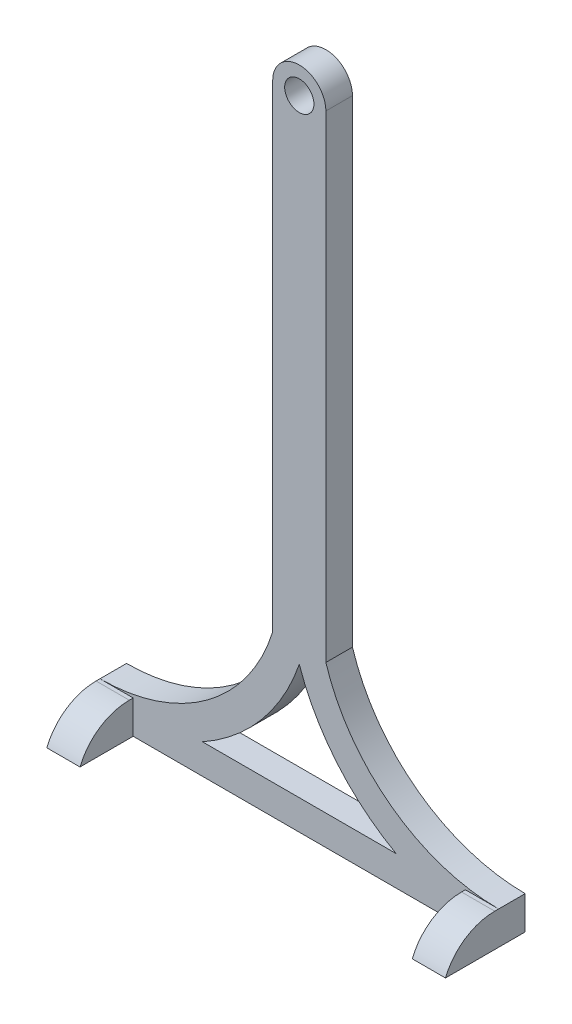
ISO-10303-21;
HEADER;
FILE_DESCRIPTION(('STEP AP214'),'2;1');
FILE_NAME('part.step','',(''),(''),'','','');
FILE_SCHEMA(('AUTOMOTIVE_DESIGN { 1 0 10303 214 1 1 1 1 }'));
ENDSEC;
DATA;
#1=APPLICATION_CONTEXT('core data for automotive mechanical design processes');
#2=APPLICATION_PROTOCOL_DEFINITION('international standard','automotive_design',2000,#1);
#3=PRODUCT_CONTEXT('',#1,'mechanical');
#4=PRODUCT('Part','Part','',(#3));
#5=PRODUCT_RELATED_PRODUCT_CATEGORY('part','',(#4));
#6=PRODUCT_DEFINITION_FORMATION('','',#4);
#7=PRODUCT_DEFINITION_CONTEXT('part definition',#1,'design');
#8=PRODUCT_DEFINITION('design','',#6,#7);
#9=PRODUCT_DEFINITION_SHAPE('','',#8);
#10=(LENGTH_UNIT() NAMED_UNIT(*) SI_UNIT(.MILLI.,.METRE.));
#11=(NAMED_UNIT(*) PLANE_ANGLE_UNIT() SI_UNIT($,.RADIAN.));
#12=(NAMED_UNIT(*) SI_UNIT($,.STERADIAN.) SOLID_ANGLE_UNIT());
#13=UNCERTAINTY_MEASURE_WITH_UNIT(LENGTH_MEASURE(1.E-05),#10,'distance_accuracy_value','');
#14=(GEOMETRIC_REPRESENTATION_CONTEXT(3) GLOBAL_UNCERTAINTY_ASSIGNED_CONTEXT((#13)) GLOBAL_UNIT_ASSIGNED_CONTEXT((#10,
#11,#12)) REPRESENTATION_CONTEXT('',''));
#15=CARTESIAN_POINT('',(0.,0.,0.));
#16=DIRECTION('',(0.,0.,1.));
#17=DIRECTION('',(1.,0.,0.));
#18=AXIS2_PLACEMENT_3D('',#15,#16,#17);
#19=CARTESIAN_POINT('',(30.,32.2359051377666,4.));
#20=DIRECTION('',(0.,0.,-1.));
#21=DIRECTION('',(-1.,0.,0.));
#22=AXIS2_PLACEMENT_3D('',#19,#20,#21);
#23=PLANE('',#22);
#24=CARTESIAN_POINT('',(0.,96.,4.));
#25=DIRECTION('',(0.,0.,1.));
#26=DIRECTION('',(1.,0.,0.));
#27=AXIS2_PLACEMENT_3D('',#24,#25,#26);
#28=CIRCLE('',#27,2.2);
#29=CARTESIAN_POINT('',(2.19999999999998,96.,4.));
#30=VERTEX_POINT('',#29);
#31=EDGE_CURVE('E248',#30,#30,#28,.T.);
#32=ORIENTED_EDGE('',*,*,#31,.F.);
#33=EDGE_LOOP('',(#32));
#34=FACE_BOUND('',#33,.T.);
#35=CARTESIAN_POINT('',(30.,32.2359051377666,4.));
#36=DIRECTION('',(0.,0.,-1.));
#37=DIRECTION('',(-1.,0.,0.));
#38=AXIS2_PLACEMENT_3D('',#35,#36,#37);
#39=CIRCLE('',#38,31.7359051377666);
#40=CARTESIAN_POINT('',(14.5764063492929,4.5,4.));
#41=VERTEX_POINT('',#40);
#42=CARTESIAN_POINT('',(0.,21.8837230048382,4.));
#43=VERTEX_POINT('',#42);
#44=EDGE_CURVE('E215',#41,#43,#39,.T.);
#45=ORIENTED_EDGE('',*,*,#44,.F.);
#46=DIRECTION('',(1.,0.,0.));
#47=VECTOR('',#46,1.);
#48=CARTESIAN_POINT('',(-14.5764063492929,4.5,4.));
#49=LINE('',#48,#47);
#50=CARTESIAN_POINT('',(-14.5764063492929,4.5,4.));
#51=VERTEX_POINT('',#50);
#52=EDGE_CURVE('E223',#51,#41,#49,.T.);
#53=ORIENTED_EDGE('',*,*,#52,.F.);
#54=CARTESIAN_POINT('',(-30.,32.2359051377666,4.));
#55=DIRECTION('',(0.,0.,-1.));
#56=DIRECTION('',(1.,0.,0.));
#57=AXIS2_PLACEMENT_3D('',#54,#55,#56);
#58=CIRCLE('',#57,31.7359051377666);
#59=EDGE_CURVE('E218',#43,#51,#58,.T.);
#60=ORIENTED_EDGE('',*,*,#59,.F.);
#61=EDGE_LOOP('',(#45,#53,#60));
#62=FACE_BOUND('',#61,.T.);
#63=DIRECTION('',(-1.,0.,0.));
#64=VECTOR('',#63,1.);
#65=CARTESIAN_POINT('',(30.,5.,4.));
#66=LINE('',#65,#64);
#67=CARTESIAN_POINT('',(30.,5.,4.));
#68=VERTEX_POINT('',#67);
#69=CARTESIAN_POINT('',(25.,5.,4.));
#70=VERTEX_POINT('',#69);
#71=EDGE_CURVE('E181',#68,#70,#66,.T.);
#72=ORIENTED_EDGE('',*,*,#71,.F.);
#73=CARTESIAN_POINT('',(30.,32.2359051377666,4.));
#74=DIRECTION('',(0.,0.,-1.));
#75=DIRECTION('',(-1.,0.,0.));
#76=AXIS2_PLACEMENT_3D('',#73,#74,#75);
#77=CIRCLE('',#76,27.2359051377666);
#78=CARTESIAN_POINT('',(3.99999999999999,24.1245224767512,4.));
#79=VERTEX_POINT('',#78);
#80=EDGE_CURVE('E256',#68,#79,#77,.T.);
#81=ORIENTED_EDGE('',*,*,#80,.T.);
#82=DIRECTION('',(0.,1.,0.));
#83=VECTOR('',#82,1.);
#84=CARTESIAN_POINT('',(3.99999999999999,96.,4.));
#85=LINE('',#84,#83);
#86=CARTESIAN_POINT('',(3.99999999999999,96.,4.));
#87=VERTEX_POINT('',#86);
#88=EDGE_CURVE('E260',#79,#87,#85,.T.);
#89=ORIENTED_EDGE('',*,*,#88,.T.);
#90=CARTESIAN_POINT('',(0.,96.,4.));
#91=DIRECTION('',(0.,0.,1.));
#92=DIRECTION('',(1.,0.,0.));
#93=AXIS2_PLACEMENT_3D('',#90,#91,#92);
#94=CIRCLE('',#93,4.);
#95=CARTESIAN_POINT('',(-4.00000000000002,96.,4.));
#96=VERTEX_POINT('',#95);
#97=EDGE_CURVE('E264',#87,#96,#94,.T.);
#98=ORIENTED_EDGE('',*,*,#97,.T.);
#99=DIRECTION('',(0.,-1.,0.));
#100=VECTOR('',#99,1.);
#101=CARTESIAN_POINT('',(-4.00000000000002,96.,4.));
#102=LINE('',#101,#100);
#103=CARTESIAN_POINT('',(-3.99999999999998,24.1245224767512,4.));
#104=VERTEX_POINT('',#103);
#105=EDGE_CURVE('E267',#96,#104,#102,.T.);
#106=ORIENTED_EDGE('',*,*,#105,.T.);
#107=CARTESIAN_POINT('',(-30.,32.2359051377666,4.));
#108=DIRECTION('',(0.,0.,-1.));
#109=DIRECTION('',(1.,0.,0.));
#110=AXIS2_PLACEMENT_3D('',#107,#108,#109);
#111=CIRCLE('',#110,27.2359051377666);
#112=CARTESIAN_POINT('',(-30.,5.,4.));
#113=VERTEX_POINT('',#112);
#114=EDGE_CURVE('E270',#104,#113,#111,.T.);
#115=ORIENTED_EDGE('',*,*,#114,.T.);
#116=DIRECTION('',(-1.,0.,0.));
#117=VECTOR('',#116,1.);
#118=CARTESIAN_POINT('',(-30.,5.,4.));
#119=LINE('',#118,#117);
#120=CARTESIAN_POINT('',(-25.,5.,4.));
#121=VERTEX_POINT('',#120);
#122=EDGE_CURVE('E198',#121,#113,#119,.T.);
#123=ORIENTED_EDGE('',*,*,#122,.F.);
#124=DIRECTION('',(0.,1.,0.));
#125=VECTOR('',#124,1.);
#126=CARTESIAN_POINT('',(-25.,0.,4.));
#127=LINE('',#126,#125);
#128=CARTESIAN_POINT('',(-25.,0.,4.));
#129=VERTEX_POINT('',#128);
#130=EDGE_CURVE('E192',#129,#121,#127,.T.);
#131=ORIENTED_EDGE('',*,*,#130,.F.);
#132=DIRECTION('',(1.,0.,0.));
#133=VECTOR('',#132,1.);
#134=CARTESIAN_POINT('',(-30.,0.,4.));
#135=LINE('',#134,#133);
#136=CARTESIAN_POINT('',(25.,0.,4.));
#137=VERTEX_POINT('',#136);
#138=EDGE_CURVE('E274',#129,#137,#135,.T.);
#139=ORIENTED_EDGE('',*,*,#138,.T.);
#140=DIRECTION('',(0.,-1.,0.));
#141=VECTOR('',#140,1.);
#142=CARTESIAN_POINT('',(25.,0.,4.));
#143=LINE('',#142,#141);
#144=EDGE_CURVE('E168',#70,#137,#143,.T.);
#145=ORIENTED_EDGE('',*,*,#144,.F.);
#146=EDGE_LOOP('',(#72,#81,#89,#98,#106,#115,#123,#131,#139,#145));
#147=FACE_BOUND('',#146,.T.);
#148=ADVANCED_FACE('F39',(#34,#62,#147),#23,.F.);
#149=CARTESIAN_POINT('',(30.,32.2359051377666,0.));
#150=DIRECTION('',(0.,0.,-1.));
#151=DIRECTION('',(-1.,0.,0.));
#152=AXIS2_PLACEMENT_3D('',#149,#150,#151);
#153=PLANE('',#152);
#154=CARTESIAN_POINT('',(30.,32.2359051377666,0.));
#155=DIRECTION('',(0.,0.,-1.));
#156=DIRECTION('',(-1.,0.,0.));
#157=AXIS2_PLACEMENT_3D('',#154,#155,#156);
#158=CIRCLE('',#157,27.2359051377666);
#159=CARTESIAN_POINT('',(30.,5.,0.));
#160=VERTEX_POINT('',#159);
#161=CARTESIAN_POINT('',(3.99999999999999,24.1245224767512,0.));
#162=VERTEX_POINT('',#161);
#163=EDGE_CURVE('E252',#160,#162,#158,.T.);
#164=ORIENTED_EDGE('',*,*,#163,.F.);
#165=DIRECTION('',(0.,1.,0.));
#166=VECTOR('',#165,1.);
#167=CARTESIAN_POINT('',(30.,0.,0.));
#168=LINE('',#167,#166);
#169=CARTESIAN_POINT('',(30.,0.,0.));
#170=VERTEX_POINT('',#169);
#171=EDGE_CURVE('E261',#170,#160,#168,.T.);
#172=ORIENTED_EDGE('',*,*,#171,.F.);
#173=DIRECTION('',(1.,0.,0.));
#174=VECTOR('',#173,1.);
#175=CARTESIAN_POINT('',(-30.,0.,0.));
#176=LINE('',#175,#174);
#177=CARTESIAN_POINT('',(-30.,0.,0.));
#178=VERTEX_POINT('',#177);
#179=EDGE_CURVE('E296',#178,#170,#176,.T.);
#180=ORIENTED_EDGE('',*,*,#179,.F.);
#181=DIRECTION('',(0.,-1.,0.));
#182=VECTOR('',#181,1.);
#183=CARTESIAN_POINT('',(-30.,0.,0.));
#184=LINE('',#183,#182);
#185=CARTESIAN_POINT('',(-30.,5.,0.));
#186=VERTEX_POINT('',#185);
#187=EDGE_CURVE('E293',#186,#178,#184,.T.);
#188=ORIENTED_EDGE('',*,*,#187,.F.);
#189=CARTESIAN_POINT('',(-30.,32.2359051377666,0.));
#190=DIRECTION('',(0.,0.,-1.));
#191=DIRECTION('',(1.,0.,0.));
#192=AXIS2_PLACEMENT_3D('',#189,#190,#191);
#193=CIRCLE('',#192,27.2359051377666);
#194=CARTESIAN_POINT('',(-3.99999999999998,24.1245224767512,0.));
#195=VERTEX_POINT('',#194);
#196=EDGE_CURVE('E290',#195,#186,#193,.T.);
#197=ORIENTED_EDGE('',*,*,#196,.F.);
#198=DIRECTION('',(0.,-1.,0.));
#199=VECTOR('',#198,1.);
#200=CARTESIAN_POINT('',(-4.00000000000002,96.,0.));
#201=LINE('',#200,#199);
#202=CARTESIAN_POINT('',(-4.00000000000002,96.,0.));
#203=VERTEX_POINT('',#202);
#204=EDGE_CURVE('E287',#203,#195,#201,.T.);
#205=ORIENTED_EDGE('',*,*,#204,.F.);
#206=CARTESIAN_POINT('',(0.,96.,0.));
#207=DIRECTION('',(0.,0.,1.));
#208=DIRECTION('',(1.,0.,0.));
#209=AXIS2_PLACEMENT_3D('',#206,#207,#208);
#210=CIRCLE('',#209,4.);
#211=CARTESIAN_POINT('',(3.99999999999999,96.,0.));
#212=VERTEX_POINT('',#211);
#213=EDGE_CURVE('E284',#212,#203,#210,.T.);
#214=ORIENTED_EDGE('',*,*,#213,.F.);
#215=DIRECTION('',(0.,1.,0.));
#216=VECTOR('',#215,1.);
#217=CARTESIAN_POINT('',(3.99999999999999,96.,0.));
#218=LINE('',#217,#216);
#219=EDGE_CURVE('E281',#162,#212,#218,.T.);
#220=ORIENTED_EDGE('',*,*,#219,.F.);
#221=EDGE_LOOP('',(#164,#172,#180,#188,#197,#205,#214,#220));
#222=FACE_BOUND('',#221,.T.);
#223=CARTESIAN_POINT('',(0.,96.,0.));
#224=DIRECTION('',(0.,0.,1.));
#225=DIRECTION('',(1.,0.,0.));
#226=AXIS2_PLACEMENT_3D('',#223,#224,#225);
#227=CIRCLE('',#226,2.2);
#228=CARTESIAN_POINT('',(2.19999999999998,96.,0.));
#229=VERTEX_POINT('',#228);
#230=EDGE_CURVE('E247',#229,#229,#227,.T.);
#231=ORIENTED_EDGE('',*,*,#230,.T.);
#232=EDGE_LOOP('',(#231));
#233=FACE_BOUND('',#232,.T.);
#234=DIRECTION('',(1.,0.,0.));
#235=VECTOR('',#234,1.);
#236=CARTESIAN_POINT('',(-14.5764063492929,4.5,0.));
#237=LINE('',#236,#235);
#238=CARTESIAN_POINT('',(-14.5764063492929,4.5,0.));
#239=VERTEX_POINT('',#238);
#240=CARTESIAN_POINT('',(14.5764063492929,4.5,0.));
#241=VERTEX_POINT('',#240);
#242=EDGE_CURVE('E219',#239,#241,#237,.T.);
#243=ORIENTED_EDGE('',*,*,#242,.T.);
#244=CARTESIAN_POINT('',(30.,32.2359051377666,0.));
#245=DIRECTION('',(0.,0.,-1.));
#246=DIRECTION('',(-1.,0.,0.));
#247=AXIS2_PLACEMENT_3D('',#244,#245,#246);
#248=CIRCLE('',#247,31.7359051377666);
#249=CARTESIAN_POINT('',(0.,21.8837230048382,0.));
#250=VERTEX_POINT('',#249);
#251=EDGE_CURVE('E214',#241,#250,#248,.T.);
#252=ORIENTED_EDGE('',*,*,#251,.T.);
#253=CARTESIAN_POINT('',(-30.,32.2359051377666,0.));
#254=DIRECTION('',(0.,0.,-1.));
#255=DIRECTION('',(1.,0.,0.));
#256=AXIS2_PLACEMENT_3D('',#253,#254,#255);
#257=CIRCLE('',#256,31.7359051377666);
#258=EDGE_CURVE('E230',#250,#239,#257,.T.);
#259=ORIENTED_EDGE('',*,*,#258,.T.);
#260=EDGE_LOOP('',(#243,#252,#259));
#261=FACE_BOUND('',#260,.T.);
#262=ADVANCED_FACE('F361',(#222,#233,#261),#153,.T.);
#263=CARTESIAN_POINT('',(30.,32.2359051377666,4.));
#264=DIRECTION('',(0.,0.,-1.));
#265=DIRECTION('',(-1.,0.,0.));
#266=AXIS2_PLACEMENT_3D('',#263,#264,#265);
#267=CYLINDRICAL_SURFACE('',#266,27.2359051377666);
#268=ORIENTED_EDGE('',*,*,#163,.T.);
#269=DIRECTION('',(0.,0.,-1.));
#270=VECTOR('',#269,1.);
#271=CARTESIAN_POINT('',(3.99999999999999,24.1245224767512,4.));
#272=LINE('',#271,#270);
#273=EDGE_CURVE('E161',#79,#162,#272,.T.);
#274=ORIENTED_EDGE('',*,*,#273,.F.);
#275=ORIENTED_EDGE('',*,*,#80,.F.);
#276=DIRECTION('',(0.,0.,-1.));
#277=VECTOR('',#276,1.);
#278=CARTESIAN_POINT('',(30.,5.,4.));
#279=LINE('',#278,#277);
#280=EDGE_CURVE('E277',#68,#160,#279,.T.);
#281=ORIENTED_EDGE('',*,*,#280,.T.);
#282=EDGE_LOOP('',(#268,#274,#275,#281));
#283=FACE_BOUND('',#282,.T.);
#284=ADVANCED_FACE('F347',(#283),#267,.F.);
#285=CARTESIAN_POINT('',(3.99999999999999,96.,4.));
#286=DIRECTION('',(-1.,0.,0.));
#287=DIRECTION('',(0.,-1.,0.));
#288=AXIS2_PLACEMENT_3D('',#285,#286,#287);
#289=PLANE('',#288);
#290=ORIENTED_EDGE('',*,*,#219,.T.);
#291=DIRECTION('',(0.,0.,-1.));
#292=VECTOR('',#291,1.);
#293=CARTESIAN_POINT('',(3.99999999999999,96.,4.));
#294=LINE('',#293,#292);
#295=EDGE_CURVE('E322',#87,#212,#294,.T.);
#296=ORIENTED_EDGE('',*,*,#295,.F.);
#297=ORIENTED_EDGE('',*,*,#88,.F.);
#298=ORIENTED_EDGE('',*,*,#273,.T.);
#299=EDGE_LOOP('',(#290,#296,#297,#298));
#300=FACE_BOUND('',#299,.T.);
#301=ADVANCED_FACE('F367',(#300),#289,.F.);
#302=CARTESIAN_POINT('',(0.,96.,4.));
#303=DIRECTION('',(0.,0.,-1.));
#304=DIRECTION('',(-1.,0.,0.));
#305=AXIS2_PLACEMENT_3D('',#302,#303,#304);
#306=CYLINDRICAL_SURFACE('',#305,4.);
#307=ORIENTED_EDGE('',*,*,#213,.T.);
#308=DIRECTION('',(0.,0.,-1.));
#309=VECTOR('',#308,1.);
#310=CARTESIAN_POINT('',(-4.00000000000002,96.,4.));
#311=LINE('',#310,#309);
#312=EDGE_CURVE('E318',#96,#203,#311,.T.);
#313=ORIENTED_EDGE('',*,*,#312,.F.);
#314=ORIENTED_EDGE('',*,*,#97,.F.);
#315=ORIENTED_EDGE('',*,*,#295,.T.);
#316=EDGE_LOOP('',(#307,#313,#314,#315));
#317=FACE_BOUND('',#316,.T.);
#318=ADVANCED_FACE('F371',(#317),#306,.T.);
#319=CARTESIAN_POINT('',(-4.00000000000002,96.,4.));
#320=DIRECTION('',(1.,0.,0.));
#321=DIRECTION('',(0.,1.,0.));
#322=AXIS2_PLACEMENT_3D('',#319,#320,#321);
#323=PLANE('',#322);
#324=ORIENTED_EDGE('',*,*,#204,.T.);
#325=DIRECTION('',(0.,0.,-1.));
#326=VECTOR('',#325,1.);
#327=CARTESIAN_POINT('',(-3.99999999999998,24.1245224767512,4.));
#328=LINE('',#327,#326);
#329=EDGE_CURVE('E314',#104,#195,#328,.T.);
#330=ORIENTED_EDGE('',*,*,#329,.F.);
#331=ORIENTED_EDGE('',*,*,#105,.F.);
#332=ORIENTED_EDGE('',*,*,#312,.T.);
#333=EDGE_LOOP('',(#324,#330,#331,#332));
#334=FACE_BOUND('',#333,.T.);
#335=ADVANCED_FACE('F377',(#334),#323,.F.);
#336=CARTESIAN_POINT('',(-30.,32.2359051377666,4.));
#337=DIRECTION('',(0.,0.,-1.));
#338=DIRECTION('',(-1.,0.,0.));
#339=AXIS2_PLACEMENT_3D('',#336,#337,#338);
#340=CYLINDRICAL_SURFACE('',#339,27.2359051377666);
#341=ORIENTED_EDGE('',*,*,#196,.T.);
#342=DIRECTION('',(0.,0.,-1.));
#343=VECTOR('',#342,1.);
#344=CARTESIAN_POINT('',(-30.,5.,4.));
#345=LINE('',#344,#343);
#346=EDGE_CURVE('E310',#113,#186,#345,.T.);
#347=ORIENTED_EDGE('',*,*,#346,.F.);
#348=ORIENTED_EDGE('',*,*,#114,.F.);
#349=ORIENTED_EDGE('',*,*,#329,.T.);
#350=EDGE_LOOP('',(#341,#347,#348,#349));
#351=FACE_BOUND('',#350,.T.);
#352=ADVANCED_FACE('F379',(#351),#340,.F.);
#353=CARTESIAN_POINT('',(-30.,0.,4.));
#354=DIRECTION('',(1.,0.,0.));
#355=DIRECTION('',(0.,0.,-1.));
#356=AXIS2_PLACEMENT_3D('',#353,#354,#355);
#357=PLANE('',#356);
#358=DIRECTION('',(0.,0.,-1.));
#359=VECTOR('',#358,1.);
#360=CARTESIAN_POINT('',(-30.,0.,4.));
#361=LINE('',#360,#359);
#362=CARTESIAN_POINT('',(-30.,0.,12.));
#363=VERTEX_POINT('',#362);
#364=EDGE_CURVE('E306',#363,#178,#361,.T.);
#365=ORIENTED_EDGE('',*,*,#364,.F.);
#366=CARTESIAN_POINT('',(-30.,-3.,4.58380151290434));
#367=DIRECTION('',(1.,0.,0.));
#368=DIRECTION('',(0.,0.,-1.));
#369=AXIS2_PLACEMENT_3D('',#366,#367,#368);
#370=CIRCLE('',#369,8.);
#371=CARTESIAN_POINT('',(-30.,5.,4.58380151290434));
#372=VERTEX_POINT('',#371);
#373=EDGE_CURVE('E62',#363,#372,#370,.F.);
#374=ORIENTED_EDGE('',*,*,#373,.T.);
#375=DIRECTION('',(0.,0.,-1.));
#376=VECTOR('',#375,1.);
#377=CARTESIAN_POINT('',(-30.,5.,12.));
#378=LINE('',#377,#376);
#379=EDGE_CURVE('E197',#372,#113,#378,.T.);
#380=ORIENTED_EDGE('',*,*,#379,.T.);
#381=ORIENTED_EDGE('',*,*,#346,.T.);
#382=ORIENTED_EDGE('',*,*,#187,.T.);
#383=EDGE_LOOP('',(#365,#374,#380,#381,#382));
#384=FACE_BOUND('',#383,.T.);
#385=ADVANCED_FACE('F381',(#384),#357,.F.);
#386=CARTESIAN_POINT('',(-30.,0.,4.));
#387=DIRECTION('',(0.,1.,0.));
#388=DIRECTION('',(0.,0.,1.));
#389=AXIS2_PLACEMENT_3D('',#386,#387,#388);
#390=PLANE('',#389);
#391=ORIENTED_EDGE('',*,*,#179,.T.);
#392=DIRECTION('',(0.,0.,-1.));
#393=VECTOR('',#392,1.);
#394=CARTESIAN_POINT('',(30.,0.,4.));
#395=LINE('',#394,#393);
#396=CARTESIAN_POINT('',(30.,0.,12.));
#397=VERTEX_POINT('',#396);
#398=EDGE_CURVE('E177',#397,#170,#395,.T.);
#399=ORIENTED_EDGE('',*,*,#398,.F.);
#400=DIRECTION('',(1.,0.,0.));
#401=VECTOR('',#400,1.);
#402=CARTESIAN_POINT('',(30.,0.,12.));
#403=LINE('',#402,#401);
#404=CARTESIAN_POINT('',(25.,0.,12.));
#405=VERTEX_POINT('',#404);
#406=EDGE_CURVE('E156',#405,#397,#403,.T.);
#407=ORIENTED_EDGE('',*,*,#406,.F.);
#408=DIRECTION('',(0.,0.,-1.));
#409=VECTOR('',#408,1.);
#410=CARTESIAN_POINT('',(25.,0.,12.));
#411=LINE('',#410,#409);
#412=EDGE_CURVE('E165',#405,#137,#411,.T.);
#413=ORIENTED_EDGE('',*,*,#412,.T.);
#414=ORIENTED_EDGE('',*,*,#138,.F.);
#415=DIRECTION('',(0.,0.,-1.));
#416=VECTOR('',#415,1.);
#417=CARTESIAN_POINT('',(-25.,0.,12.));
#418=LINE('',#417,#416);
#419=CARTESIAN_POINT('',(-25.,0.,12.));
#420=VERTEX_POINT('',#419);
#421=EDGE_CURVE('E210',#420,#129,#418,.T.);
#422=ORIENTED_EDGE('',*,*,#421,.F.);
#423=DIRECTION('',(1.,0.,0.));
#424=VECTOR('',#423,1.);
#425=CARTESIAN_POINT('',(-30.,0.,12.));
#426=LINE('',#425,#424);
#427=EDGE_CURVE('E193',#363,#420,#426,.T.);
#428=ORIENTED_EDGE('',*,*,#427,.F.);
#429=ORIENTED_EDGE('',*,*,#364,.T.);
#430=EDGE_LOOP('',(#391,#399,#407,#413,#414,#422,#428,#429));
#431=FACE_BOUND('',#430,.T.);
#432=ADVANCED_FACE('F175',(#431),#390,.F.);
#433=CARTESIAN_POINT('',(30.,0.,4.));
#434=DIRECTION('',(-1.,0.,0.));
#435=DIRECTION('',(0.,0.,1.));
#436=AXIS2_PLACEMENT_3D('',#433,#434,#435);
#437=PLANE('',#436);
#438=DIRECTION('',(0.,0.,-1.));
#439=VECTOR('',#438,1.);
#440=CARTESIAN_POINT('',(30.,5.,12.));
#441=LINE('',#440,#439);
#442=CARTESIAN_POINT('',(30.,5.,4.58380151290434));
#443=VERTEX_POINT('',#442);
#444=EDGE_CURVE('E189',#443,#68,#441,.T.);
#445=ORIENTED_EDGE('',*,*,#444,.F.);
#446=CARTESIAN_POINT('',(30.,-3.00000000000001,4.58380151290434));
#447=DIRECTION('',(-1.,0.,0.));
#448=DIRECTION('',(0.,0.,1.));
#449=AXIS2_PLACEMENT_3D('',#446,#447,#448);
#450=CIRCLE('',#449,8.);
#451=EDGE_CURVE('E331',#443,#397,#450,.F.);
#452=ORIENTED_EDGE('',*,*,#451,.T.);
#453=ORIENTED_EDGE('',*,*,#398,.T.);
#454=ORIENTED_EDGE('',*,*,#171,.T.);
#455=ORIENTED_EDGE('',*,*,#280,.F.);
#456=EDGE_LOOP('',(#445,#452,#453,#454,#455));
#457=FACE_BOUND('',#456,.T.);
#458=ADVANCED_FACE('F338',(#457),#437,.F.);
#459=CARTESIAN_POINT('',(0.,96.,4.));
#460=DIRECTION('',(0.,0.,-1.));
#461=DIRECTION('',(-1.,0.,0.));
#462=AXIS2_PLACEMENT_3D('',#459,#460,#461);
#463=CYLINDRICAL_SURFACE('',#462,2.2);
#464=ORIENTED_EDGE('',*,*,#31,.T.);
#465=EDGE_LOOP('',(#464));
#466=FACE_BOUND('',#465,.T.);
#467=ORIENTED_EDGE('',*,*,#230,.F.);
#468=EDGE_LOOP('',(#467));
#469=FACE_BOUND('',#468,.T.);
#470=ADVANCED_FACE('F400',(#466,#469),#463,.F.);
#471=CARTESIAN_POINT('',(30.,32.2359051377666,4.));
#472=DIRECTION('',(0.,0.,-1.));
#473=DIRECTION('',(-1.,0.,0.));
#474=AXIS2_PLACEMENT_3D('',#471,#472,#473);
#475=CYLINDRICAL_SURFACE('',#474,31.7359051377666);
#476=ORIENTED_EDGE('',*,*,#251,.F.);
#477=DIRECTION('',(0.,0.,-1.));
#478=VECTOR('',#477,1.);
#479=CARTESIAN_POINT('',(14.5764063492929,4.5,4.));
#480=LINE('',#479,#478);
#481=EDGE_CURVE('E226',#41,#241,#480,.T.);
#482=ORIENTED_EDGE('',*,*,#481,.F.);
#483=ORIENTED_EDGE('',*,*,#44,.T.);
#484=DIRECTION('',(0.,0.,-1.));
#485=VECTOR('',#484,1.);
#486=CARTESIAN_POINT('',(0.,21.8837230048382,4.));
#487=LINE('',#486,#485);
#488=EDGE_CURVE('E243',#43,#250,#487,.T.);
#489=ORIENTED_EDGE('',*,*,#488,.T.);
#490=EDGE_LOOP('',(#476,#482,#483,#489));
#491=FACE_BOUND('',#490,.T.);
#492=ADVANCED_FACE('F407',(#491),#475,.T.);
#493=CARTESIAN_POINT('',(-30.,32.2359051377666,4.));
#494=DIRECTION('',(0.,0.,-1.));
#495=DIRECTION('',(-1.,0.,0.));
#496=AXIS2_PLACEMENT_3D('',#493,#494,#495);
#497=CYLINDRICAL_SURFACE('',#496,31.7359051377666);
#498=ORIENTED_EDGE('',*,*,#258,.F.);
#499=ORIENTED_EDGE('',*,*,#488,.F.);
#500=ORIENTED_EDGE('',*,*,#59,.T.);
#501=DIRECTION('',(0.,0.,-1.));
#502=VECTOR('',#501,1.);
#503=CARTESIAN_POINT('',(-14.5764063492929,4.5,4.));
#504=LINE('',#503,#502);
#505=EDGE_CURVE('E240',#51,#239,#504,.T.);
#506=ORIENTED_EDGE('',*,*,#505,.T.);
#507=EDGE_LOOP('',(#498,#499,#500,#506));
#508=FACE_BOUND('',#507,.T.);
#509=ADVANCED_FACE('F412',(#508),#497,.T.);
#510=CARTESIAN_POINT('',(-14.5764063492929,4.5,4.));
#511=DIRECTION('',(0.,1.,0.));
#512=DIRECTION('',(0.,0.,1.));
#513=AXIS2_PLACEMENT_3D('',#510,#511,#512);
#514=PLANE('',#513);
#515=ORIENTED_EDGE('',*,*,#242,.F.);
#516=ORIENTED_EDGE('',*,*,#505,.F.);
#517=ORIENTED_EDGE('',*,*,#52,.T.);
#518=ORIENTED_EDGE('',*,*,#481,.T.);
#519=EDGE_LOOP('',(#515,#516,#517,#518));
#520=FACE_BOUND('',#519,.T.);
#521=ADVANCED_FACE('F419',(#520),#514,.T.);
#522=CARTESIAN_POINT('',(-25.,0.,12.));
#523=DIRECTION('',(-1.,0.,0.));
#524=DIRECTION('',(0.,0.,1.));
#525=AXIS2_PLACEMENT_3D('',#522,#523,#524);
#526=PLANE('',#525);
#527=DIRECTION('',(0.,0.,-1.));
#528=VECTOR('',#527,1.);
#529=CARTESIAN_POINT('',(-25.,5.,12.));
#530=LINE('',#529,#528);
#531=CARTESIAN_POINT('',(-25.,5.,4.58380151290434));
#532=VERTEX_POINT('',#531);
#533=EDGE_CURVE('E207',#532,#121,#530,.T.);
#534=ORIENTED_EDGE('',*,*,#533,.F.);
#535=CARTESIAN_POINT('',(-25.,-3.,4.58380151290434));
#536=DIRECTION('',(-1.,0.,0.));
#537=DIRECTION('',(0.,0.,1.));
#538=AXIS2_PLACEMENT_3D('',#535,#536,#537);
#539=CIRCLE('',#538,8.);
#540=EDGE_CURVE('E11',#532,#420,#539,.F.);
#541=ORIENTED_EDGE('',*,*,#540,.T.);
#542=ORIENTED_EDGE('',*,*,#421,.T.);
#543=ORIENTED_EDGE('',*,*,#130,.T.);
#544=EDGE_LOOP('',(#534,#541,#542,#543));
#545=FACE_BOUND('',#544,.T.);
#546=ADVANCED_FACE('F355',(#545),#526,.F.);
#547=CARTESIAN_POINT('',(-30.,5.,12.));
#548=DIRECTION('',(0.,-1.,0.));
#549=DIRECTION('',(0.,0.,-1.));
#550=AXIS2_PLACEMENT_3D('',#547,#548,#549);
#551=PLANE('',#550);
#552=ORIENTED_EDGE('',*,*,#379,.F.);
#553=DIRECTION('',(1.,0.,0.));
#554=VECTOR('',#553,1.);
#555=CARTESIAN_POINT('',(-30.,5.,4.58380151290434));
#556=LINE('',#555,#554);
#557=EDGE_CURVE('E48',#372,#532,#556,.T.);
#558=ORIENTED_EDGE('',*,*,#557,.T.);
#559=ORIENTED_EDGE('',*,*,#533,.T.);
#560=ORIENTED_EDGE('',*,*,#122,.T.);
#561=EDGE_LOOP('',(#552,#558,#559,#560));
#562=FACE_BOUND('',#561,.T.);
#563=ADVANCED_FACE('F380',(#562),#551,.F.);
#564=CARTESIAN_POINT('',(30.,5.,12.));
#565=DIRECTION('',(0.,-1.,0.));
#566=DIRECTION('',(1.,0.,0.));
#567=AXIS2_PLACEMENT_3D('',#564,#565,#566);
#568=PLANE('',#567);
#569=DIRECTION('',(0.,0.,-1.));
#570=VECTOR('',#569,1.);
#571=CARTESIAN_POINT('',(25.,5.,12.));
#572=LINE('',#571,#570);
#573=CARTESIAN_POINT('',(25.,5.,4.58380151290434));
#574=VERTEX_POINT('',#573);
#575=EDGE_CURVE('E172',#574,#70,#572,.T.);
#576=ORIENTED_EDGE('',*,*,#575,.F.);
#577=DIRECTION('',(-1.,0.,0.));
#578=VECTOR('',#577,1.);
#579=CARTESIAN_POINT('',(30.,5.,4.58380151290434));
#580=LINE('',#579,#578);
#581=EDGE_CURVE('E157',#574,#443,#580,.F.);
#582=ORIENTED_EDGE('',*,*,#581,.T.);
#583=ORIENTED_EDGE('',*,*,#444,.T.);
#584=ORIENTED_EDGE('',*,*,#71,.T.);
#585=EDGE_LOOP('',(#576,#582,#583,#584));
#586=FACE_BOUND('',#585,.T.);
#587=ADVANCED_FACE('F344',(#586),#568,.F.);
#588=CARTESIAN_POINT('',(25.,0.,12.));
#589=DIRECTION('',(1.,0.,0.));
#590=DIRECTION('',(0.,0.,-1.));
#591=AXIS2_PLACEMENT_3D('',#588,#589,#590);
#592=PLANE('',#591);
#593=ORIENTED_EDGE('',*,*,#412,.F.);
#594=CARTESIAN_POINT('',(25.,-3.00000000000001,4.58380151290434));
#595=DIRECTION('',(1.,0.,0.));
#596=DIRECTION('',(0.,0.,-1.));
#597=AXIS2_PLACEMENT_3D('',#594,#595,#596);
#598=CIRCLE('',#597,8.);
#599=EDGE_CURVE('E151',#405,#574,#598,.F.);
#600=ORIENTED_EDGE('',*,*,#599,.T.);
#601=ORIENTED_EDGE('',*,*,#575,.T.);
#602=ORIENTED_EDGE('',*,*,#144,.T.);
#603=EDGE_LOOP('',(#593,#600,#601,#602));
#604=FACE_BOUND('',#603,.T.);
#605=ADVANCED_FACE('F166',(#604),#592,.F.);
#606=CARTESIAN_POINT('',(0.,-3.00000000000001,4.58380151290434));
#607=DIRECTION('',(-1.,0.,0.));
#608=DIRECTION('',(0.,0.,1.));
#609=AXIS2_PLACEMENT_3D('',#606,#607,#608);
#610=CYLINDRICAL_SURFACE('',#609,8.);
#611=ORIENTED_EDGE('',*,*,#451,.F.);
#612=ORIENTED_EDGE('',*,*,#581,.F.);
#613=ORIENTED_EDGE('',*,*,#599,.F.);
#614=ORIENTED_EDGE('',*,*,#406,.T.);
#615=EDGE_LOOP('',(#611,#612,#613,#614));
#616=FACE_BOUND('',#615,.T.);
#617=ADVANCED_FACE('F154',(#616),#610,.T.);
#618=CARTESIAN_POINT('',(0.,-3.,4.58380151290434));
#619=DIRECTION('',(1.,0.,0.));
#620=DIRECTION('',(0.,0.,-1.));
#621=AXIS2_PLACEMENT_3D('',#618,#619,#620);
#622=CYLINDRICAL_SURFACE('',#621,8.);
#623=ORIENTED_EDGE('',*,*,#540,.F.);
#624=ORIENTED_EDGE('',*,*,#557,.F.);
#625=ORIENTED_EDGE('',*,*,#373,.F.);
#626=ORIENTED_EDGE('',*,*,#427,.T.);
#627=EDGE_LOOP('',(#623,#624,#625,#626));
#628=FACE_BOUND('',#627,.T.);
#629=ADVANCED_FACE('F41',(#628),#622,.T.);
#630=CLOSED_SHELL('',(#148,#262,#284,#301,#318,#335,#352,#385,#432,#458,#470,#492,#509,#521,
#546,#563,#587,#605,#617,#629));
#631=MANIFOLD_SOLID_BREP('B2',#630);
#632=ADVANCED_BREP_SHAPE_REPRESENTATION('',(#18,#631),#14);
#633=SHAPE_DEFINITION_REPRESENTATION(#9,#632);
ENDSEC;
END-ISO-10303-21;
